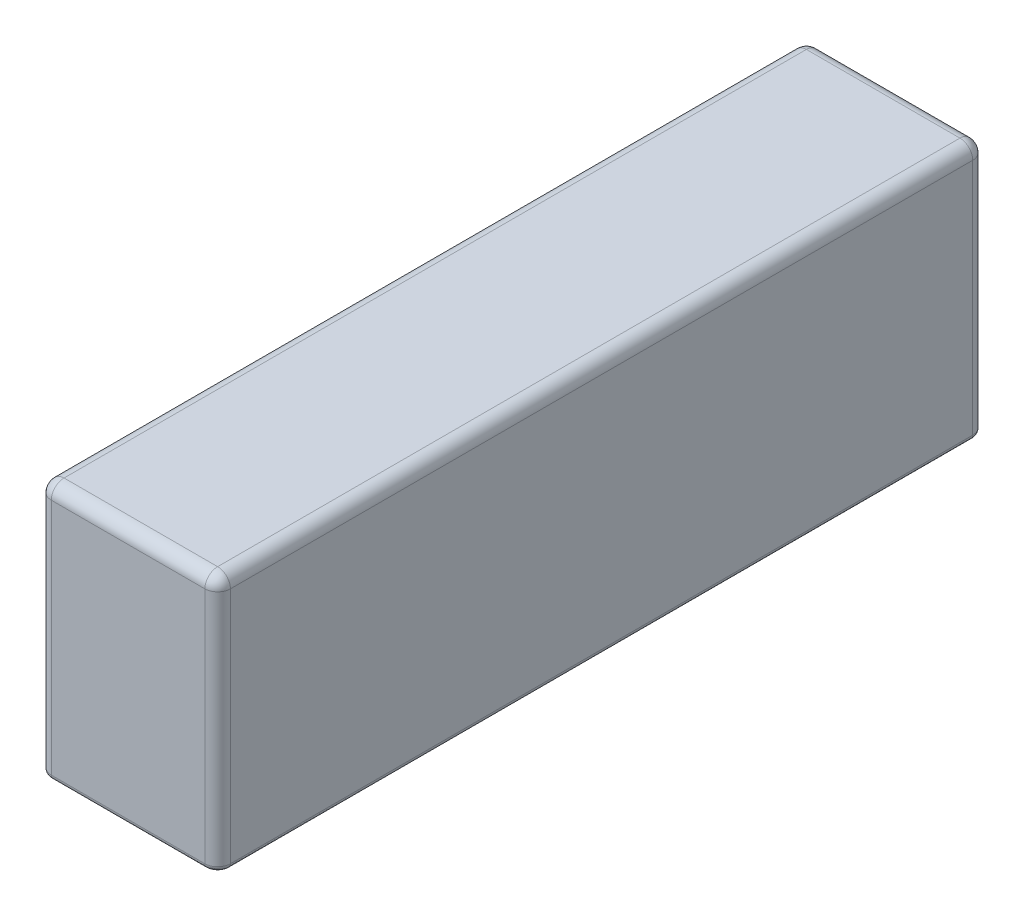
ISO-10303-21;
HEADER;
FILE_DESCRIPTION(('STEP AP214'),'2;1');
FILE_NAME('part.step','',(''),(''),'','','');
FILE_SCHEMA(('AUTOMOTIVE_DESIGN { 1 0 10303 214 1 1 1 1 }'));
ENDSEC;
DATA;
#1=APPLICATION_CONTEXT('core data for automotive mechanical design processes');
#2=APPLICATION_PROTOCOL_DEFINITION('international standard','automotive_design',2000,#1);
#3=PRODUCT_CONTEXT('',#1,'mechanical');
#4=PRODUCT('Part','Part','',(#3));
#5=PRODUCT_RELATED_PRODUCT_CATEGORY('part','',(#4));
#6=PRODUCT_DEFINITION_FORMATION('','',#4);
#7=PRODUCT_DEFINITION_CONTEXT('part definition',#1,'design');
#8=PRODUCT_DEFINITION('design','',#6,#7);
#9=PRODUCT_DEFINITION_SHAPE('','',#8);
#10=(LENGTH_UNIT() NAMED_UNIT(*) SI_UNIT(.MILLI.,.METRE.));
#11=(NAMED_UNIT(*) PLANE_ANGLE_UNIT() SI_UNIT($,.RADIAN.));
#12=(NAMED_UNIT(*) SI_UNIT($,.STERADIAN.) SOLID_ANGLE_UNIT());
#13=UNCERTAINTY_MEASURE_WITH_UNIT(LENGTH_MEASURE(1.E-05),#10,'distance_accuracy_value','');
#14=(GEOMETRIC_REPRESENTATION_CONTEXT(3) GLOBAL_UNCERTAINTY_ASSIGNED_CONTEXT((#13)) GLOBAL_UNIT_ASSIGNED_CONTEXT((#10,
#11,#12)) REPRESENTATION_CONTEXT('',''));
#15=CARTESIAN_POINT('',(0.,0.,0.));
#16=DIRECTION('',(0.,0.,1.));
#17=DIRECTION('',(1.,0.,0.));
#18=AXIS2_PLACEMENT_3D('',#15,#16,#17);
#19=CARTESIAN_POINT('',(3.5,5.,15.));
#20=DIRECTION('',(-1.,0.,0.));
#21=DIRECTION('',(0.,0.,1.));
#22=AXIS2_PLACEMENT_3D('',#19,#20,#21);
#23=PLANE('',#22);
#24=DIRECTION('',(0.,-1.,0.));
#25=VECTOR('',#24,1.);
#26=CARTESIAN_POINT('',(3.5,5.,14.5));
#27=LINE('',#26,#25);
#28=CARTESIAN_POINT('',(3.5,4.5,14.5));
#29=VERTEX_POINT('',#28);
#30=CARTESIAN_POINT('',(3.5,-4.8,14.5));
#31=VERTEX_POINT('',#30);
#32=EDGE_CURVE('E204',#29,#31,#27,.T.);
#33=ORIENTED_EDGE('',*,*,#32,.T.);
#34=DIRECTION('',(0.,0.,-1.));
#35=VECTOR('',#34,1.);
#36=CARTESIAN_POINT('',(3.5,-4.8,-14.5));
#37=LINE('',#36,#35);
#38=CARTESIAN_POINT('',(3.5,-4.8,-14.5));
#39=VERTEX_POINT('',#38);
#40=EDGE_CURVE('E257',#31,#39,#37,.T.);
#41=ORIENTED_EDGE('',*,*,#40,.T.);
#42=DIRECTION('',(0.,-1.,0.));
#43=VECTOR('',#42,1.);
#44=CARTESIAN_POINT('',(3.5,5.,-14.5));
#45=LINE('',#44,#43);
#46=CARTESIAN_POINT('',(3.5,4.5,-14.5));
#47=VERTEX_POINT('',#46);
#48=EDGE_CURVE('E209',#39,#47,#45,.F.);
#49=ORIENTED_EDGE('',*,*,#48,.T.);
#50=DIRECTION('',(0.,0.,-1.));
#51=VECTOR('',#50,1.);
#52=CARTESIAN_POINT('',(3.5,4.5,15.));
#53=LINE('',#52,#51);
#54=EDGE_CURVE('E207',#47,#29,#53,.F.);
#55=ORIENTED_EDGE('',*,*,#54,.T.);
#56=EDGE_LOOP('',(#33,#41,#49,#55));
#57=FACE_BOUND('',#56,.T.);
#58=ADVANCED_FACE('F43',(#57),#23,.F.);
#59=CARTESIAN_POINT('',(-3.5,5.,-15.));
#60=DIRECTION('',(0.,0.,1.));
#61=DIRECTION('',(1.,0.,0.));
#62=AXIS2_PLACEMENT_3D('',#59,#60,#61);
#63=PLANE('',#62);
#64=DIRECTION('',(0.,-1.,0.));
#65=VECTOR('',#64,1.);
#66=CARTESIAN_POINT('',(3.,5.,-15.));
#67=LINE('',#66,#65);
#68=CARTESIAN_POINT('',(3.,4.5,-15.));
#69=VERTEX_POINT('',#68);
#70=CARTESIAN_POINT('',(3.,-4.8,-15.));
#71=VERTEX_POINT('',#70);
#72=EDGE_CURVE('E198',#69,#71,#67,.T.);
#73=ORIENTED_EDGE('',*,*,#72,.T.);
#74=DIRECTION('',(-1.,0.,0.));
#75=VECTOR('',#74,1.);
#76=CARTESIAN_POINT('',(-3.,-4.8,-15.));
#77=LINE('',#76,#75);
#78=CARTESIAN_POINT('',(-3.,-4.8,-15.));
#79=VERTEX_POINT('',#78);
#80=EDGE_CURVE('E67',#71,#79,#77,.T.);
#81=ORIENTED_EDGE('',*,*,#80,.T.);
#82=DIRECTION('',(0.,-1.,0.));
#83=VECTOR('',#82,1.);
#84=CARTESIAN_POINT('',(-3.,5.,-15.));
#85=LINE('',#84,#83);
#86=CARTESIAN_POINT('',(-3.,4.5,-15.));
#87=VERTEX_POINT('',#86);
#88=EDGE_CURVE('E202',#79,#87,#85,.F.);
#89=ORIENTED_EDGE('',*,*,#88,.T.);
#90=DIRECTION('',(-1.,0.,0.));
#91=VECTOR('',#90,1.);
#92=CARTESIAN_POINT('',(-3.5,4.5,-15.));
#93=LINE('',#92,#91);
#94=EDGE_CURVE('E200',#87,#69,#93,.F.);
#95=ORIENTED_EDGE('',*,*,#94,.T.);
#96=EDGE_LOOP('',(#73,#81,#89,#95));
#97=FACE_BOUND('',#96,.T.);
#98=ADVANCED_FACE('F299',(#97),#63,.F.);
#99=CARTESIAN_POINT('',(-3.5,5.,15.));
#100=DIRECTION('',(1.,0.,0.));
#101=DIRECTION('',(0.,0.,-1.));
#102=AXIS2_PLACEMENT_3D('',#99,#100,#101);
#103=PLANE('',#102);
#104=DIRECTION('',(0.,-1.,0.));
#105=VECTOR('',#104,1.);
#106=CARTESIAN_POINT('',(-3.5,5.,-14.5));
#107=LINE('',#106,#105);
#108=CARTESIAN_POINT('',(-3.5,4.5,-14.5));
#109=VERTEX_POINT('',#108);
#110=CARTESIAN_POINT('',(-3.5,-4.8,-14.5));
#111=VERTEX_POINT('',#110);
#112=EDGE_CURVE('E196',#109,#111,#107,.T.);
#113=ORIENTED_EDGE('',*,*,#112,.T.);
#114=DIRECTION('',(0.,0.,1.));
#115=VECTOR('',#114,1.);
#116=CARTESIAN_POINT('',(-3.5,-4.8,14.5));
#117=LINE('',#116,#115);
#118=CARTESIAN_POINT('',(-3.5,-4.8,14.5));
#119=VERTEX_POINT('',#118);
#120=EDGE_CURVE('E11',#111,#119,#117,.T.);
#121=ORIENTED_EDGE('',*,*,#120,.T.);
#122=DIRECTION('',(0.,-1.,0.));
#123=VECTOR('',#122,1.);
#124=CARTESIAN_POINT('',(-3.5,5.,14.5));
#125=LINE('',#124,#123);
#126=CARTESIAN_POINT('',(-3.5,4.5,14.5));
#127=VERTEX_POINT('',#126);
#128=EDGE_CURVE('E192',#119,#127,#125,.F.);
#129=ORIENTED_EDGE('',*,*,#128,.T.);
#130=DIRECTION('',(0.,0.,1.));
#131=VECTOR('',#130,1.);
#132=CARTESIAN_POINT('',(-3.5,4.5,15.));
#133=LINE('',#132,#131);
#134=EDGE_CURVE('E194',#127,#109,#133,.F.);
#135=ORIENTED_EDGE('',*,*,#134,.T.);
#136=EDGE_LOOP('',(#113,#121,#129,#135));
#137=FACE_BOUND('',#136,.T.);
#138=ADVANCED_FACE('F348',(#137),#103,.F.);
#139=CARTESIAN_POINT('',(-3.5,5.,15.));
#140=DIRECTION('',(0.,0.,-1.));
#141=DIRECTION('',(-1.,0.,0.));
#142=AXIS2_PLACEMENT_3D('',#139,#140,#141);
#143=PLANE('',#142);
#144=DIRECTION('',(0.,-1.,0.));
#145=VECTOR('',#144,1.);
#146=CARTESIAN_POINT('',(-3.,5.,15.));
#147=LINE('',#146,#145);
#148=CARTESIAN_POINT('',(-3.,4.5,15.));
#149=VERTEX_POINT('',#148);
#150=CARTESIAN_POINT('',(-3.,-4.8,15.));
#151=VERTEX_POINT('',#150);
#152=EDGE_CURVE('E189',#149,#151,#147,.T.);
#153=ORIENTED_EDGE('',*,*,#152,.T.);
#154=DIRECTION('',(1.,0.,0.));
#155=VECTOR('',#154,1.);
#156=CARTESIAN_POINT('',(3.,-4.8,15.));
#157=LINE('',#156,#155);
#158=CARTESIAN_POINT('',(3.,-4.8,15.));
#159=VERTEX_POINT('',#158);
#160=EDGE_CURVE('E253',#151,#159,#157,.T.);
#161=ORIENTED_EDGE('',*,*,#160,.T.);
#162=DIRECTION('',(0.,-1.,0.));
#163=VECTOR('',#162,1.);
#164=CARTESIAN_POINT('',(3.,5.,15.));
#165=LINE('',#164,#163);
#166=CARTESIAN_POINT('',(3.,4.5,15.));
#167=VERTEX_POINT('',#166);
#168=EDGE_CURVE('E182',#159,#167,#165,.F.);
#169=ORIENTED_EDGE('',*,*,#168,.T.);
#170=DIRECTION('',(1.,0.,0.));
#171=VECTOR('',#170,1.);
#172=CARTESIAN_POINT('',(-3.5,4.5,15.));
#173=LINE('',#172,#171);
#174=EDGE_CURVE('E153',#167,#149,#173,.F.);
#175=ORIENTED_EDGE('',*,*,#174,.T.);
#176=EDGE_LOOP('',(#153,#161,#169,#175));
#177=FACE_BOUND('',#176,.T.);
#178=ADVANCED_FACE('F323',(#177),#143,.F.);
#179=CARTESIAN_POINT('',(0.,5.,0.));
#180=DIRECTION('',(0.,-1.,0.));
#181=DIRECTION('',(0.,0.,-1.));
#182=AXIS2_PLACEMENT_3D('',#179,#180,#181);
#183=PLANE('',#182);
#184=DIRECTION('',(0.,0.,1.));
#185=VECTOR('',#184,1.);
#186=CARTESIAN_POINT('',(-3.,5.,0.));
#187=LINE('',#186,#185);
#188=CARTESIAN_POINT('',(-3.,5.,-14.5));
#189=VERTEX_POINT('',#188);
#190=CARTESIAN_POINT('',(-3.,5.,14.5));
#191=VERTEX_POINT('',#190);
#192=EDGE_CURVE('E180',#189,#191,#187,.T.);
#193=ORIENTED_EDGE('',*,*,#192,.T.);
#194=DIRECTION('',(1.,0.,0.));
#195=VECTOR('',#194,1.);
#196=CARTESIAN_POINT('',(0.,5.,14.5));
#197=LINE('',#196,#195);
#198=CARTESIAN_POINT('',(3.,5.,14.5));
#199=VERTEX_POINT('',#198);
#200=EDGE_CURVE('E151',#191,#199,#197,.T.);
#201=ORIENTED_EDGE('',*,*,#200,.T.);
#202=DIRECTION('',(0.,0.,-1.));
#203=VECTOR('',#202,1.);
#204=CARTESIAN_POINT('',(3.,5.,0.));
#205=LINE('',#204,#203);
#206=CARTESIAN_POINT('',(3.,5.,-14.5));
#207=VERTEX_POINT('',#206);
#208=EDGE_CURVE('E169',#199,#207,#205,.T.);
#209=ORIENTED_EDGE('',*,*,#208,.T.);
#210=DIRECTION('',(-1.,0.,0.));
#211=VECTOR('',#210,1.);
#212=CARTESIAN_POINT('',(0.,5.,-14.5));
#213=LINE('',#212,#211);
#214=EDGE_CURVE('E175',#207,#189,#213,.T.);
#215=ORIENTED_EDGE('',*,*,#214,.T.);
#216=EDGE_LOOP('',(#193,#201,#209,#215));
#217=FACE_BOUND('',#216,.T.);
#218=ADVANCED_FACE('F178',(#217),#183,.F.);
#219=CARTESIAN_POINT('',(0.,-5.,0.));
#220=DIRECTION('',(0.,-1.,0.));
#221=DIRECTION('',(0.,0.,-1.));
#222=AXIS2_PLACEMENT_3D('',#219,#220,#221);
#223=PLANE('',#222);
#224=DIRECTION('',(1.,0.,0.));
#225=VECTOR('',#224,1.);
#226=CARTESIAN_POINT('',(-3.,-5.,14.8));
#227=LINE('',#226,#225);
#228=CARTESIAN_POINT('',(3.,-5.,14.8));
#229=VERTEX_POINT('',#228);
#230=CARTESIAN_POINT('',(-3.,-5.,14.8));
#231=VERTEX_POINT('',#230);
#232=EDGE_CURVE('E245',#229,#231,#227,.F.);
#233=ORIENTED_EDGE('',*,*,#232,.T.);
#234=CARTESIAN_POINT('',(-3.,-5.,14.5));
#235=DIRECTION('',(0.,-1.,0.));
#236=DIRECTION('',(0.,0.,-1.));
#237=AXIS2_PLACEMENT_3D('',#234,#235,#236);
#238=CIRCLE('',#237,0.3);
#239=CARTESIAN_POINT('',(-3.3,-5.,14.5));
#240=VERTEX_POINT('',#239);
#241=EDGE_CURVE('E247',#231,#240,#238,.T.);
#242=ORIENTED_EDGE('',*,*,#241,.T.);
#243=DIRECTION('',(0.,0.,1.));
#244=VECTOR('',#243,1.);
#245=CARTESIAN_POINT('',(-3.3,-5.,-14.5));
#246=LINE('',#245,#244);
#247=CARTESIAN_POINT('',(-3.3,-5.,-14.5));
#248=VERTEX_POINT('',#247);
#249=EDGE_CURVE('E210',#240,#248,#246,.F.);
#250=ORIENTED_EDGE('',*,*,#249,.T.);
#251=CARTESIAN_POINT('',(-3.,-5.,-14.5));
#252=DIRECTION('',(0.,-1.,0.));
#253=DIRECTION('',(0.,0.,-1.));
#254=AXIS2_PLACEMENT_3D('',#251,#252,#253);
#255=CIRCLE('',#254,0.3);
#256=CARTESIAN_POINT('',(-3.,-5.,-14.8));
#257=VERTEX_POINT('',#256);
#258=EDGE_CURVE('E235',#248,#257,#255,.T.);
#259=ORIENTED_EDGE('',*,*,#258,.T.);
#260=DIRECTION('',(-1.,0.,0.));
#261=VECTOR('',#260,1.);
#262=CARTESIAN_POINT('',(3.,-5.,-14.8));
#263=LINE('',#262,#261);
#264=CARTESIAN_POINT('',(3.,-5.,-14.8));
#265=VERTEX_POINT('',#264);
#266=EDGE_CURVE('E237',#257,#265,#263,.F.);
#267=ORIENTED_EDGE('',*,*,#266,.T.);
#268=CARTESIAN_POINT('',(3.,-5.,-14.5));
#269=DIRECTION('',(0.,-1.,0.));
#270=DIRECTION('',(0.,0.,-1.));
#271=AXIS2_PLACEMENT_3D('',#268,#269,#270);
#272=CIRCLE('',#271,0.3);
#273=CARTESIAN_POINT('',(3.3,-5.,-14.5));
#274=VERTEX_POINT('',#273);
#275=EDGE_CURVE('E239',#265,#274,#272,.T.);
#276=ORIENTED_EDGE('',*,*,#275,.T.);
#277=DIRECTION('',(0.,0.,-1.));
#278=VECTOR('',#277,1.);
#279=CARTESIAN_POINT('',(3.3,-5.,14.5));
#280=LINE('',#279,#278);
#281=CARTESIAN_POINT('',(3.3,-5.,14.5));
#282=VERTEX_POINT('',#281);
#283=EDGE_CURVE('E241',#274,#282,#280,.F.);
#284=ORIENTED_EDGE('',*,*,#283,.T.);
#285=CARTESIAN_POINT('',(3.,-5.,14.5));
#286=DIRECTION('',(0.,-1.,0.));
#287=DIRECTION('',(0.,0.,-1.));
#288=AXIS2_PLACEMENT_3D('',#285,#286,#287);
#289=CIRCLE('',#288,0.3);
#290=EDGE_CURVE('E243',#282,#229,#289,.T.);
#291=ORIENTED_EDGE('',*,*,#290,.T.);
#292=EDGE_LOOP('',(#233,#242,#250,#259,#267,#276,#284,#291));
#293=FACE_BOUND('',#292,.T.);
#294=ADVANCED_FACE('F473',(#293),#223,.T.);
#295=CARTESIAN_POINT('',(-3.,5.,-14.5));
#296=DIRECTION('',(0.,-1.,0.));
#297=DIRECTION('',(0.,0.,-1.));
#298=AXIS2_PLACEMENT_3D('',#295,#296,#297);
#299=CYLINDRICAL_SURFACE('',#298,0.5);
#300=ORIENTED_EDGE('',*,*,#88,.F.);
#301=CARTESIAN_POINT('',(-3.,-4.8,-14.5));
#302=DIRECTION('',(0.,-1.,0.));
#303=DIRECTION('',(0.,0.,-1.));
#304=AXIS2_PLACEMENT_3D('',#301,#302,#303);
#305=CIRCLE('',#304,0.5);
#306=EDGE_CURVE('E52',#79,#111,#305,.F.);
#307=ORIENTED_EDGE('',*,*,#306,.T.);
#308=ORIENTED_EDGE('',*,*,#112,.F.);
#309=CARTESIAN_POINT('',(-3.,4.5,-14.5));
#310=DIRECTION('',(0.,1.,0.));
#311=DIRECTION('',(0.,0.,1.));
#312=AXIS2_PLACEMENT_3D('',#309,#310,#311);
#313=CIRCLE('',#312,0.5);
#314=EDGE_CURVE('E176',#87,#109,#313,.T.);
#315=ORIENTED_EDGE('',*,*,#314,.F.);
#316=EDGE_LOOP('',(#300,#307,#308,#315));
#317=FACE_BOUND('',#316,.T.);
#318=ADVANCED_FACE('F306',(#317),#299,.T.);
#319=CARTESIAN_POINT('',(0.,4.5,-14.5));
#320=DIRECTION('',(-1.,0.,0.));
#321=DIRECTION('',(0.,0.,1.));
#322=AXIS2_PLACEMENT_3D('',#319,#320,#321);
#323=CYLINDRICAL_SURFACE('',#322,0.5);
#324=CARTESIAN_POINT('',(3.,4.5,-14.5));
#325=DIRECTION('',(1.,0.,0.));
#326=DIRECTION('',(0.,1.,0.));
#327=AXIS2_PLACEMENT_3D('',#324,#325,#326);
#328=CIRCLE('',#327,0.5);
#329=EDGE_CURVE('E226',#69,#207,#328,.T.);
#330=ORIENTED_EDGE('',*,*,#329,.F.);
#331=ORIENTED_EDGE('',*,*,#94,.F.);
#332=CARTESIAN_POINT('',(-3.,4.5,-14.5));
#333=DIRECTION('',(-1.,0.,0.));
#334=DIRECTION('',(0.,0.,1.));
#335=AXIS2_PLACEMENT_3D('',#332,#333,#334);
#336=CIRCLE('',#335,0.5);
#337=EDGE_CURVE('E229',#189,#87,#336,.T.);
#338=ORIENTED_EDGE('',*,*,#337,.F.);
#339=ORIENTED_EDGE('',*,*,#214,.F.);
#340=EDGE_LOOP('',(#330,#331,#338,#339));
#341=FACE_BOUND('',#340,.T.);
#342=ADVANCED_FACE('F304',(#341),#323,.T.);
#343=CARTESIAN_POINT('',(3.,5.,-14.5));
#344=DIRECTION('',(0.,-1.,0.));
#345=DIRECTION('',(0.,0.,-1.));
#346=AXIS2_PLACEMENT_3D('',#343,#344,#345);
#347=CYLINDRICAL_SURFACE('',#346,0.5);
#348=ORIENTED_EDGE('',*,*,#48,.F.);
#349=CARTESIAN_POINT('',(3.,-4.8,-14.5));
#350=DIRECTION('',(0.,-1.,0.));
#351=DIRECTION('',(0.,0.,-1.));
#352=AXIS2_PLACEMENT_3D('',#349,#350,#351);
#353=CIRCLE('',#352,0.5);
#354=EDGE_CURVE('E259',#39,#71,#353,.F.);
#355=ORIENTED_EDGE('',*,*,#354,.T.);
#356=ORIENTED_EDGE('',*,*,#72,.F.);
#357=CARTESIAN_POINT('',(3.,4.5,-14.5));
#358=DIRECTION('',(0.,1.,0.));
#359=DIRECTION('',(0.,0.,1.));
#360=AXIS2_PLACEMENT_3D('',#357,#358,#359);
#361=CIRCLE('',#360,0.5);
#362=EDGE_CURVE('E223',#47,#69,#361,.T.);
#363=ORIENTED_EDGE('',*,*,#362,.F.);
#364=EDGE_LOOP('',(#348,#355,#356,#363));
#365=FACE_BOUND('',#364,.T.);
#366=ADVANCED_FACE('F296',(#365),#347,.T.);
#367=CARTESIAN_POINT('',(-3.,4.5,-14.5));
#368=DIRECTION('',(0.,0.,-1.));
#369=DIRECTION('',(-1.,0.,0.));
#370=AXIS2_PLACEMENT_3D('',#367,#368,#369);
#371=SPHERICAL_SURFACE('',#370,0.5);
#372=ORIENTED_EDGE('',*,*,#337,.T.);
#373=ORIENTED_EDGE('',*,*,#314,.T.);
#374=CARTESIAN_POINT('',(-3.,4.5,-14.5));
#375=DIRECTION('',(0.,0.,-1.));
#376=DIRECTION('',(-1.,0.,0.));
#377=AXIS2_PLACEMENT_3D('',#374,#375,#376);
#378=CIRCLE('',#377,0.5);
#379=EDGE_CURVE('E220',#189,#109,#378,.F.);
#380=ORIENTED_EDGE('',*,*,#379,.F.);
#381=EDGE_LOOP('',(#372,#373,#380));
#382=FACE_BOUND('',#381,.T.);
#383=ADVANCED_FACE('F309',(#382),#371,.T.);
#384=CARTESIAN_POINT('',(3.,4.5,-14.5));
#385=DIRECTION('',(0.,0.,-1.));
#386=DIRECTION('',(-1.,0.,0.));
#387=AXIS2_PLACEMENT_3D('',#384,#385,#386);
#388=SPHERICAL_SURFACE('',#387,0.5);
#389=ORIENTED_EDGE('',*,*,#362,.T.);
#390=ORIENTED_EDGE('',*,*,#329,.T.);
#391=CARTESIAN_POINT('',(3.,4.5,-14.5));
#392=DIRECTION('',(0.,0.,-1.));
#393=DIRECTION('',(-1.,0.,0.));
#394=AXIS2_PLACEMENT_3D('',#391,#392,#393);
#395=CIRCLE('',#394,0.5);
#396=EDGE_CURVE('E172',#47,#207,#395,.F.);
#397=ORIENTED_EDGE('',*,*,#396,.F.);
#398=EDGE_LOOP('',(#389,#390,#397));
#399=FACE_BOUND('',#398,.T.);
#400=ADVANCED_FACE('F332',(#399),#388,.T.);
#401=CARTESIAN_POINT('',(-3.,5.,14.5));
#402=DIRECTION('',(0.,-1.,0.));
#403=DIRECTION('',(0.,0.,-1.));
#404=AXIS2_PLACEMENT_3D('',#401,#402,#403);
#405=CYLINDRICAL_SURFACE('',#404,0.5);
#406=ORIENTED_EDGE('',*,*,#128,.F.);
#407=CARTESIAN_POINT('',(-3.,-4.8,14.5));
#408=DIRECTION('',(0.,-1.,0.));
#409=DIRECTION('',(0.,0.,-1.));
#410=AXIS2_PLACEMENT_3D('',#407,#408,#409);
#411=CIRCLE('',#410,0.5);
#412=EDGE_CURVE('E250',#119,#151,#411,.F.);
#413=ORIENTED_EDGE('',*,*,#412,.T.);
#414=ORIENTED_EDGE('',*,*,#152,.F.);
#415=CARTESIAN_POINT('',(-3.,4.5,14.5));
#416=DIRECTION('',(0.,1.,0.));
#417=DIRECTION('',(0.,0.,1.));
#418=AXIS2_PLACEMENT_3D('',#415,#416,#417);
#419=CIRCLE('',#418,0.5);
#420=EDGE_CURVE('E216',#127,#149,#419,.T.);
#421=ORIENTED_EDGE('',*,*,#420,.F.);
#422=EDGE_LOOP('',(#406,#413,#414,#421));
#423=FACE_BOUND('',#422,.T.);
#424=ADVANCED_FACE('F320',(#423),#405,.T.);
#425=CARTESIAN_POINT('',(-3.,4.5,0.));
#426=DIRECTION('',(0.,0.,1.));
#427=DIRECTION('',(1.,0.,0.));
#428=AXIS2_PLACEMENT_3D('',#425,#426,#427);
#429=CYLINDRICAL_SURFACE('',#428,0.5);
#430=ORIENTED_EDGE('',*,*,#379,.T.);
#431=ORIENTED_EDGE('',*,*,#134,.F.);
#432=CARTESIAN_POINT('',(-3.,4.5,14.5));
#433=DIRECTION('',(0.,0.,1.));
#434=DIRECTION('',(1.,0.,0.));
#435=AXIS2_PLACEMENT_3D('',#432,#433,#434);
#436=CIRCLE('',#435,0.5);
#437=EDGE_CURVE('E166',#191,#127,#436,.T.);
#438=ORIENTED_EDGE('',*,*,#437,.F.);
#439=ORIENTED_EDGE('',*,*,#192,.F.);
#440=EDGE_LOOP('',(#430,#431,#438,#439));
#441=FACE_BOUND('',#440,.T.);
#442=ADVANCED_FACE('F312',(#441),#429,.T.);
#443=CARTESIAN_POINT('',(3.,4.5,0.));
#444=DIRECTION('',(0.,0.,-1.));
#445=DIRECTION('',(-1.,0.,0.));
#446=AXIS2_PLACEMENT_3D('',#443,#444,#445);
#447=CYLINDRICAL_SURFACE('',#446,0.5);
#448=ORIENTED_EDGE('',*,*,#396,.T.);
#449=ORIENTED_EDGE('',*,*,#208,.F.);
#450=CARTESIAN_POINT('',(3.,4.5,14.5));
#451=DIRECTION('',(0.,0.,1.));
#452=DIRECTION('',(1.,0.,0.));
#453=AXIS2_PLACEMENT_3D('',#450,#451,#452);
#454=CIRCLE('',#453,0.5);
#455=EDGE_CURVE('E159',#29,#199,#454,.T.);
#456=ORIENTED_EDGE('',*,*,#455,.F.);
#457=ORIENTED_EDGE('',*,*,#54,.F.);
#458=EDGE_LOOP('',(#448,#449,#456,#457));
#459=FACE_BOUND('',#458,.T.);
#460=ADVANCED_FACE('F170',(#459),#447,.T.);
#461=CARTESIAN_POINT('',(3.,5.,14.5));
#462=DIRECTION('',(0.,-1.,0.));
#463=DIRECTION('',(0.,0.,-1.));
#464=AXIS2_PLACEMENT_3D('',#461,#462,#463);
#465=CYLINDRICAL_SURFACE('',#464,0.5);
#466=ORIENTED_EDGE('',*,*,#168,.F.);
#467=CARTESIAN_POINT('',(3.,-4.8,14.5));
#468=DIRECTION('',(0.,-1.,0.));
#469=DIRECTION('',(0.,0.,-1.));
#470=AXIS2_PLACEMENT_3D('',#467,#468,#469);
#471=CIRCLE('',#470,0.5);
#472=EDGE_CURVE('E255',#159,#31,#471,.F.);
#473=ORIENTED_EDGE('',*,*,#472,.T.);
#474=ORIENTED_EDGE('',*,*,#32,.F.);
#475=CARTESIAN_POINT('',(3.,4.5,14.5));
#476=DIRECTION('',(0.,1.,0.));
#477=DIRECTION('',(0.,0.,1.));
#478=AXIS2_PLACEMENT_3D('',#475,#476,#477);
#479=CIRCLE('',#478,0.5);
#480=EDGE_CURVE('E163',#167,#29,#479,.T.);
#481=ORIENTED_EDGE('',*,*,#480,.F.);
#482=EDGE_LOOP('',(#466,#473,#474,#481));
#483=FACE_BOUND('',#482,.T.);
#484=ADVANCED_FACE('F329',(#483),#465,.T.);
#485=CARTESIAN_POINT('',(-3.,4.5,14.5));
#486=DIRECTION('',(-1.,0.,0.));
#487=DIRECTION('',(0.,0.,1.));
#488=AXIS2_PLACEMENT_3D('',#485,#486,#487);
#489=SPHERICAL_SURFACE('',#488,0.5);
#490=ORIENTED_EDGE('',*,*,#437,.T.);
#491=ORIENTED_EDGE('',*,*,#420,.T.);
#492=CARTESIAN_POINT('',(-3.,4.5,14.5));
#493=DIRECTION('',(-1.,0.,0.));
#494=DIRECTION('',(0.,0.,1.));
#495=AXIS2_PLACEMENT_3D('',#492,#493,#494);
#496=CIRCLE('',#495,0.5);
#497=EDGE_CURVE('E156',#191,#149,#496,.F.);
#498=ORIENTED_EDGE('',*,*,#497,.F.);
#499=EDGE_LOOP('',(#490,#491,#498));
#500=FACE_BOUND('',#499,.T.);
#501=ADVANCED_FACE('F316',(#500),#489,.T.);
#502=CARTESIAN_POINT('',(3.,4.5,14.5));
#503=DIRECTION('',(1.,0.,0.));
#504=DIRECTION('',(0.,0.,-1.));
#505=AXIS2_PLACEMENT_3D('',#502,#503,#504);
#506=SPHERICAL_SURFACE('',#505,0.5);
#507=ORIENTED_EDGE('',*,*,#480,.T.);
#508=ORIENTED_EDGE('',*,*,#455,.T.);
#509=CARTESIAN_POINT('',(3.,4.5,14.5));
#510=DIRECTION('',(1.,0.,0.));
#511=DIRECTION('',(0.,0.,-1.));
#512=AXIS2_PLACEMENT_3D('',#509,#510,#511);
#513=CIRCLE('',#512,0.5);
#514=EDGE_CURVE('E147',#167,#199,#513,.F.);
#515=ORIENTED_EDGE('',*,*,#514,.F.);
#516=EDGE_LOOP('',(#507,#508,#515));
#517=FACE_BOUND('',#516,.T.);
#518=ADVANCED_FACE('F161',(#517),#506,.T.);
#519=CARTESIAN_POINT('',(0.,4.5,14.5));
#520=DIRECTION('',(1.,0.,0.));
#521=DIRECTION('',(0.,0.,-1.));
#522=AXIS2_PLACEMENT_3D('',#519,#520,#521);
#523=CYLINDRICAL_SURFACE('',#522,0.5);
#524=ORIENTED_EDGE('',*,*,#497,.T.);
#525=ORIENTED_EDGE('',*,*,#174,.F.);
#526=ORIENTED_EDGE('',*,*,#514,.T.);
#527=ORIENTED_EDGE('',*,*,#200,.F.);
#528=EDGE_LOOP('',(#524,#525,#526,#527));
#529=FACE_BOUND('',#528,.T.);
#530=ADVANCED_FACE('F149',(#529),#523,.T.);
#531=CARTESIAN_POINT('',(3.,-4.8,-14.5));
#532=DIRECTION('',(0.,-1.,0.));
#533=DIRECTION('',(0.,0.,-1.));
#534=AXIS2_PLACEMENT_3D('',#531,#532,#533);
#535=TOROIDAL_SURFACE('',#534,0.3,0.2);
#536=CARTESIAN_POINT('',(3.,-4.8,-14.8));
#537=DIRECTION('',(-1.,0.,0.));
#538=DIRECTION('',(0.,0.,1.));
#539=AXIS2_PLACEMENT_3D('',#536,#537,#538);
#540=CIRCLE('',#539,0.2);
#541=EDGE_CURVE('E278',#71,#265,#540,.T.);
#542=ORIENTED_EDGE('',*,*,#541,.F.);
#543=ORIENTED_EDGE('',*,*,#354,.F.);
#544=CARTESIAN_POINT('',(3.3,-4.8,-14.5));
#545=DIRECTION('',(0.,0.,1.));
#546=DIRECTION('',(1.,0.,0.));
#547=AXIS2_PLACEMENT_3D('',#544,#545,#546);
#548=CIRCLE('',#547,0.2);
#549=EDGE_CURVE('E47',#274,#39,#548,.T.);
#550=ORIENTED_EDGE('',*,*,#549,.F.);
#551=ORIENTED_EDGE('',*,*,#275,.F.);
#552=EDGE_LOOP('',(#542,#543,#550,#551));
#553=FACE_BOUND('',#552,.T.);
#554=ADVANCED_FACE('F45',(#553),#535,.T.);
#555=CARTESIAN_POINT('',(3.3,-4.8,15.));
#556=DIRECTION('',(0.,0.,1.));
#557=DIRECTION('',(1.,0.,0.));
#558=AXIS2_PLACEMENT_3D('',#555,#556,#557);
#559=CYLINDRICAL_SURFACE('',#558,0.2);
#560=ORIENTED_EDGE('',*,*,#549,.T.);
#561=ORIENTED_EDGE('',*,*,#40,.F.);
#562=CARTESIAN_POINT('',(3.3,-4.8,14.5));
#563=DIRECTION('',(0.,0.,1.));
#564=DIRECTION('',(1.,0.,0.));
#565=AXIS2_PLACEMENT_3D('',#562,#563,#564);
#566=CIRCLE('',#565,0.2);
#567=EDGE_CURVE('E276',#282,#31,#566,.T.);
#568=ORIENTED_EDGE('',*,*,#567,.F.);
#569=ORIENTED_EDGE('',*,*,#283,.F.);
#570=EDGE_LOOP('',(#560,#561,#568,#569));
#571=FACE_BOUND('',#570,.T.);
#572=ADVANCED_FACE('F288',(#571),#559,.T.);
#573=CARTESIAN_POINT('',(-3.5,-4.8,-14.8));
#574=DIRECTION('',(1.,0.,0.));
#575=DIRECTION('',(0.,0.,-1.));
#576=AXIS2_PLACEMENT_3D('',#573,#574,#575);
#577=CYLINDRICAL_SURFACE('',#576,0.2);
#578=ORIENTED_EDGE('',*,*,#541,.T.);
#579=ORIENTED_EDGE('',*,*,#266,.F.);
#580=CARTESIAN_POINT('',(-3.,-4.8,-14.8));
#581=DIRECTION('',(-1.,0.,0.));
#582=DIRECTION('',(0.,0.,1.));
#583=AXIS2_PLACEMENT_3D('',#580,#581,#582);
#584=CIRCLE('',#583,0.2);
#585=EDGE_CURVE('E273',#79,#257,#584,.T.);
#586=ORIENTED_EDGE('',*,*,#585,.F.);
#587=ORIENTED_EDGE('',*,*,#80,.F.);
#588=EDGE_LOOP('',(#578,#579,#586,#587));
#589=FACE_BOUND('',#588,.T.);
#590=ADVANCED_FACE('F403',(#589),#577,.T.);
#591=CARTESIAN_POINT('',(3.,-4.8,14.5));
#592=DIRECTION('',(0.,-1.,0.));
#593=DIRECTION('',(0.,0.,-1.));
#594=AXIS2_PLACEMENT_3D('',#591,#592,#593);
#595=TOROIDAL_SURFACE('',#594,0.3,0.2);
#596=ORIENTED_EDGE('',*,*,#567,.T.);
#597=ORIENTED_EDGE('',*,*,#472,.F.);
#598=CARTESIAN_POINT('',(3.,-4.8,14.8));
#599=DIRECTION('',(-1.,0.,0.));
#600=DIRECTION('',(0.,0.,1.));
#601=AXIS2_PLACEMENT_3D('',#598,#599,#600);
#602=CIRCLE('',#601,0.2);
#603=EDGE_CURVE('E270',#229,#159,#602,.T.);
#604=ORIENTED_EDGE('',*,*,#603,.F.);
#605=ORIENTED_EDGE('',*,*,#290,.F.);
#606=EDGE_LOOP('',(#596,#597,#604,#605));
#607=FACE_BOUND('',#606,.T.);
#608=ADVANCED_FACE('F411',(#607),#595,.T.);
#609=CARTESIAN_POINT('',(-3.,-4.8,-14.5));
#610=DIRECTION('',(0.,-1.,0.));
#611=DIRECTION('',(0.,0.,-1.));
#612=AXIS2_PLACEMENT_3D('',#609,#610,#611);
#613=TOROIDAL_SURFACE('',#612,0.3,0.2);
#614=ORIENTED_EDGE('',*,*,#585,.T.);
#615=ORIENTED_EDGE('',*,*,#258,.F.);
#616=CARTESIAN_POINT('',(-3.3,-4.8,-14.5));
#617=DIRECTION('',(0.,0.,1.));
#618=DIRECTION('',(1.,0.,0.));
#619=AXIS2_PLACEMENT_3D('',#616,#617,#618);
#620=CIRCLE('',#619,0.2);
#621=EDGE_CURVE('E267',#111,#248,#620,.T.);
#622=ORIENTED_EDGE('',*,*,#621,.F.);
#623=ORIENTED_EDGE('',*,*,#306,.F.);
#624=EDGE_LOOP('',(#614,#615,#622,#623));
#625=FACE_BOUND('',#624,.T.);
#626=ADVANCED_FACE('F420',(#625),#613,.T.);
#627=CARTESIAN_POINT('',(-3.5,-4.8,14.8));
#628=DIRECTION('',(-1.,0.,0.));
#629=DIRECTION('',(0.,0.,1.));
#630=AXIS2_PLACEMENT_3D('',#627,#628,#629);
#631=CYLINDRICAL_SURFACE('',#630,0.2);
#632=ORIENTED_EDGE('',*,*,#603,.T.);
#633=ORIENTED_EDGE('',*,*,#160,.F.);
#634=CARTESIAN_POINT('',(-3.,-4.8,14.8));
#635=DIRECTION('',(-1.,0.,0.));
#636=DIRECTION('',(0.,0.,1.));
#637=AXIS2_PLACEMENT_3D('',#634,#635,#636);
#638=CIRCLE('',#637,0.2);
#639=EDGE_CURVE('E265',#231,#151,#638,.T.);
#640=ORIENTED_EDGE('',*,*,#639,.F.);
#641=ORIENTED_EDGE('',*,*,#232,.F.);
#642=EDGE_LOOP('',(#632,#633,#640,#641));
#643=FACE_BOUND('',#642,.T.);
#644=ADVANCED_FACE('F431',(#643),#631,.T.);
#645=CARTESIAN_POINT('',(-3.3,-4.8,15.));
#646=DIRECTION('',(0.,0.,-1.));
#647=DIRECTION('',(-1.,0.,0.));
#648=AXIS2_PLACEMENT_3D('',#645,#646,#647);
#649=CYLINDRICAL_SURFACE('',#648,0.2);
#650=ORIENTED_EDGE('',*,*,#621,.T.);
#651=ORIENTED_EDGE('',*,*,#249,.F.);
#652=CARTESIAN_POINT('',(-3.3,-4.8,14.5));
#653=DIRECTION('',(0.,0.,1.));
#654=DIRECTION('',(1.,0.,0.));
#655=AXIS2_PLACEMENT_3D('',#652,#653,#654);
#656=CIRCLE('',#655,0.2);
#657=EDGE_CURVE('E263',#119,#240,#656,.T.);
#658=ORIENTED_EDGE('',*,*,#657,.F.);
#659=ORIENTED_EDGE('',*,*,#120,.F.);
#660=EDGE_LOOP('',(#650,#651,#658,#659));
#661=FACE_BOUND('',#660,.T.);
#662=ADVANCED_FACE('F442',(#661),#649,.T.);
#663=CARTESIAN_POINT('',(-3.,-4.8,14.5));
#664=DIRECTION('',(0.,-1.,0.));
#665=DIRECTION('',(0.,0.,-1.));
#666=AXIS2_PLACEMENT_3D('',#663,#664,#665);
#667=TOROIDAL_SURFACE('',#666,0.3,0.2);
#668=ORIENTED_EDGE('',*,*,#639,.T.);
#669=ORIENTED_EDGE('',*,*,#412,.F.);
#670=ORIENTED_EDGE('',*,*,#657,.T.);
#671=ORIENTED_EDGE('',*,*,#241,.F.);
#672=EDGE_LOOP('',(#668,#669,#670,#671));
#673=FACE_BOUND('',#672,.T.);
#674=ADVANCED_FACE('F452',(#673),#667,.T.);
#675=CLOSED_SHELL('',(#58,#98,#138,#178,#218,#294,#318,#342,#366,#383,#400,#424,#442,#460,#484,
#501,#518,#530,#554,#572,#590,#608,#626,#644,#662,#674));
#676=MANIFOLD_SOLID_BREP('B2',#675);
#677=ADVANCED_BREP_SHAPE_REPRESENTATION('',(#18,#676),#14);
#678=SHAPE_DEFINITION_REPRESENTATION(#9,#677);
ENDSEC;
END-ISO-10303-21;
